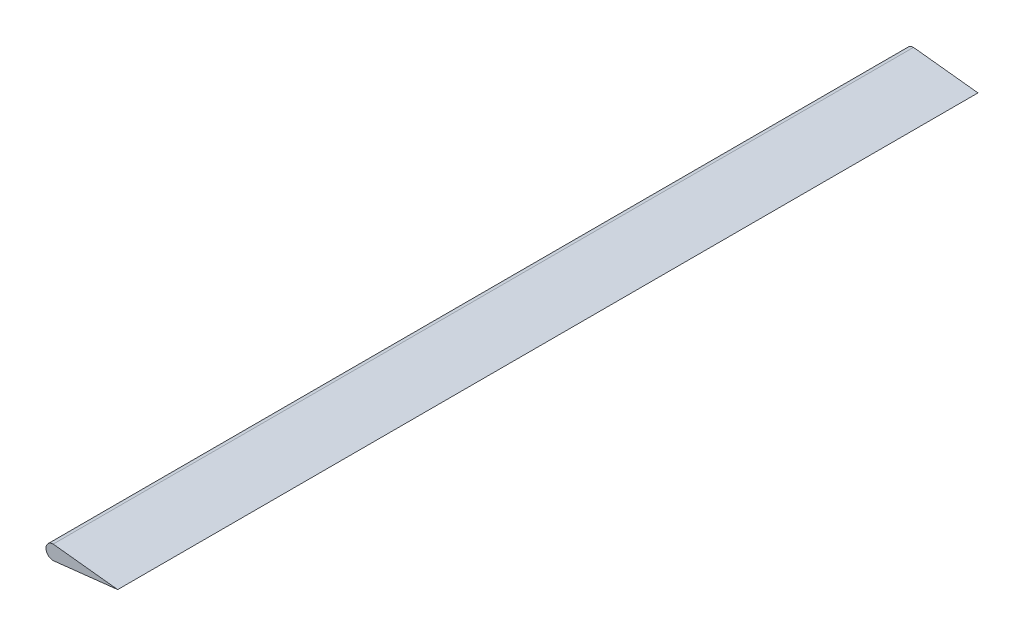
ISO-10303-21;
HEADER;
FILE_DESCRIPTION(('STEP AP214'),'2;1');
FILE_NAME('part.step','',(''),(''),'','','');
FILE_SCHEMA(('AUTOMOTIVE_DESIGN { 1 0 10303 214 1 1 1 1 }'));
ENDSEC;
DATA;
#1=APPLICATION_CONTEXT('core data for automotive mechanical design processes');
#2=APPLICATION_PROTOCOL_DEFINITION('international standard','automotive_design',2000,#1);
#3=PRODUCT_CONTEXT('',#1,'mechanical');
#4=PRODUCT('Part','Part','',(#3));
#5=PRODUCT_RELATED_PRODUCT_CATEGORY('part','',(#4));
#6=PRODUCT_DEFINITION_FORMATION('','',#4);
#7=PRODUCT_DEFINITION_CONTEXT('part definition',#1,'design');
#8=PRODUCT_DEFINITION('design','',#6,#7);
#9=PRODUCT_DEFINITION_SHAPE('','',#8);
#10=(LENGTH_UNIT() NAMED_UNIT(*) SI_UNIT(.MILLI.,.METRE.));
#11=(NAMED_UNIT(*) PLANE_ANGLE_UNIT() SI_UNIT($,.RADIAN.));
#12=(NAMED_UNIT(*) SI_UNIT($,.STERADIAN.) SOLID_ANGLE_UNIT());
#13=UNCERTAINTY_MEASURE_WITH_UNIT(LENGTH_MEASURE(1.E-05),#10,'distance_accuracy_value','');
#14=(GEOMETRIC_REPRESENTATION_CONTEXT(3) GLOBAL_UNCERTAINTY_ASSIGNED_CONTEXT((#13)) GLOBAL_UNIT_ASSIGNED_CONTEXT((#10,
#11,#12)) REPRESENTATION_CONTEXT('',''));
#15=CARTESIAN_POINT('',(0.,0.,0.));
#16=DIRECTION('',(0.,0.,1.));
#17=DIRECTION('',(1.,0.,0.));
#18=AXIS2_PLACEMENT_3D('',#15,#16,#17);
#19=CARTESIAN_POINT('',(100.,0.,12000.));
#20=DIRECTION('',(0.,0.,-1.));
#21=DIRECTION('',(-1.,0.,0.));
#22=AXIS2_PLACEMENT_3D('',#19,#20,#21);
#23=CYLINDRICAL_SURFACE('',#22,100.);
#24=CARTESIAN_POINT('',(100.,0.,0.));
#25=DIRECTION('',(0.,0.,1.));
#26=DIRECTION('',(1.,0.,0.));
#27=AXIS2_PLACEMENT_3D('',#24,#25,#26);
#28=CIRCLE('',#27,100.);
#29=CARTESIAN_POINT('',(100.,100.,0.));
#30=VERTEX_POINT('',#29);
#31=CARTESIAN_POINT('',(100.,-100.,0.));
#32=VERTEX_POINT('',#31);
#33=EDGE_CURVE('E83',#30,#32,#28,.T.);
#34=ORIENTED_EDGE('',*,*,#33,.T.);
#35=DIRECTION('',(0.,0.,-1.));
#36=VECTOR('',#35,1.);
#37=CARTESIAN_POINT('',(100.,-100.,12000.));
#38=LINE('',#37,#36);
#39=CARTESIAN_POINT('',(100.,-100.,12000.));
#40=VERTEX_POINT('',#39);
#41=EDGE_CURVE('E11',#40,#32,#38,.T.);
#42=ORIENTED_EDGE('',*,*,#41,.F.);
#43=CARTESIAN_POINT('',(100.,0.,12000.));
#44=DIRECTION('',(0.,0.,1.));
#45=DIRECTION('',(1.,0.,0.));
#46=AXIS2_PLACEMENT_3D('',#43,#44,#45);
#47=CIRCLE('',#46,100.);
#48=CARTESIAN_POINT('',(100.,100.,12000.));
#49=VERTEX_POINT('',#48);
#50=EDGE_CURVE('E74',#49,#40,#47,.T.);
#51=ORIENTED_EDGE('',*,*,#50,.F.);
#52=DIRECTION('',(0.,0.,-1.));
#53=VECTOR('',#52,1.);
#54=CARTESIAN_POINT('',(100.,100.,12000.));
#55=LINE('',#54,#53);
#56=EDGE_CURVE('E56',#49,#30,#55,.T.);
#57=ORIENTED_EDGE('',*,*,#56,.T.);
#58=EDGE_LOOP('',(#34,#42,#51,#57));
#59=FACE_BOUND('',#58,.T.);
#60=ADVANCED_FACE('F39',(#59),#23,.T.);
#61=CARTESIAN_POINT('',(1000.,0.,12000.));
#62=DIRECTION('',(0.110431526074847,-0.993883734673619,0.));
#63=DIRECTION('',(0.993883734673619,0.110431526074847,0.));
#64=AXIS2_PLACEMENT_3D('',#61,#62,#63);
#65=PLANE('',#64);
#66=DIRECTION('',(-0.993883734673619,-0.110431526074847,0.));
#67=VECTOR('',#66,1.);
#68=CARTESIAN_POINT('',(1000.,0.,0.));
#69=LINE('',#68,#67);
#70=CARTESIAN_POINT('',(1000.,0.,0.));
#71=VERTEX_POINT('',#70);
#72=EDGE_CURVE('E94',#71,#32,#69,.T.);
#73=ORIENTED_EDGE('',*,*,#72,.F.);
#74=DIRECTION('',(0.,0.,-1.));
#75=VECTOR('',#74,1.);
#76=CARTESIAN_POINT('',(1000.,0.,12000.));
#77=LINE('',#76,#75);
#78=CARTESIAN_POINT('',(1000.,0.,12000.));
#79=VERTEX_POINT('',#78);
#80=EDGE_CURVE('E48',#79,#71,#77,.T.);
#81=ORIENTED_EDGE('',*,*,#80,.F.);
#82=DIRECTION('',(-0.993883734673619,-0.110431526074847,0.));
#83=VECTOR('',#82,1.);
#84=CARTESIAN_POINT('',(1000.,0.,12000.));
#85=LINE('',#84,#83);
#86=EDGE_CURVE('E78',#79,#40,#85,.T.);
#87=ORIENTED_EDGE('',*,*,#86,.T.);
#88=ORIENTED_EDGE('',*,*,#41,.T.);
#89=EDGE_LOOP('',(#73,#81,#87,#88));
#90=FACE_BOUND('',#89,.T.);
#91=ADVANCED_FACE('F86',(#90),#65,.T.);
#92=CARTESIAN_POINT('',(100.,100.,12000.));
#93=DIRECTION('',(0.110431526074847,0.993883734673619,0.));
#94=DIRECTION('',(-0.993883734673619,0.110431526074847,0.));
#95=AXIS2_PLACEMENT_3D('',#92,#93,#94);
#96=PLANE('',#95);
#97=DIRECTION('',(0.993883734673619,-0.110431526074847,0.));
#98=VECTOR('',#97,1.);
#99=CARTESIAN_POINT('',(100.,100.,0.));
#100=LINE('',#99,#98);
#101=EDGE_CURVE('E81',#30,#71,#100,.T.);
#102=ORIENTED_EDGE('',*,*,#101,.F.);
#103=ORIENTED_EDGE('',*,*,#56,.F.);
#104=DIRECTION('',(0.993883734673619,-0.110431526074847,0.));
#105=VECTOR('',#104,1.);
#106=CARTESIAN_POINT('',(100.,100.,12000.));
#107=LINE('',#106,#105);
#108=EDGE_CURVE('E79',#49,#79,#107,.T.);
#109=ORIENTED_EDGE('',*,*,#108,.T.);
#110=ORIENTED_EDGE('',*,*,#80,.T.);
#111=EDGE_LOOP('',(#102,#103,#109,#110));
#112=FACE_BOUND('',#111,.T.);
#113=ADVANCED_FACE('F104',(#112),#96,.T.);
#114=CARTESIAN_POINT('',(100.,0.,12000.));
#115=DIRECTION('',(0.,0.,1.));
#116=DIRECTION('',(1.,0.,0.));
#117=AXIS2_PLACEMENT_3D('',#114,#115,#116);
#118=PLANE('',#117);
#119=ORIENTED_EDGE('',*,*,#50,.T.);
#120=ORIENTED_EDGE('',*,*,#86,.F.);
#121=ORIENTED_EDGE('',*,*,#108,.F.);
#122=EDGE_LOOP('',(#119,#120,#121));
#123=FACE_BOUND('',#122,.T.);
#124=ADVANCED_FACE('F76',(#123),#118,.T.);
#125=CARTESIAN_POINT('',(100.,0.,0.));
#126=DIRECTION('',(0.,0.,1.));
#127=DIRECTION('',(1.,0.,0.));
#128=AXIS2_PLACEMENT_3D('',#125,#126,#127);
#129=PLANE('',#128);
#130=ORIENTED_EDGE('',*,*,#33,.F.);
#131=ORIENTED_EDGE('',*,*,#101,.T.);
#132=ORIENTED_EDGE('',*,*,#72,.T.);
#133=EDGE_LOOP('',(#130,#131,#132));
#134=FACE_BOUND('',#133,.T.);
#135=ADVANCED_FACE('F103',(#134),#129,.F.);
#136=CLOSED_SHELL('',(#60,#91,#113,#124,#135));
#137=MANIFOLD_SOLID_BREP('B2',#136);
#138=ADVANCED_BREP_SHAPE_REPRESENTATION('',(#18,#137),#14);
#139=SHAPE_DEFINITION_REPRESENTATION(#9,#138);
ENDSEC;
END-ISO-10303-21;
